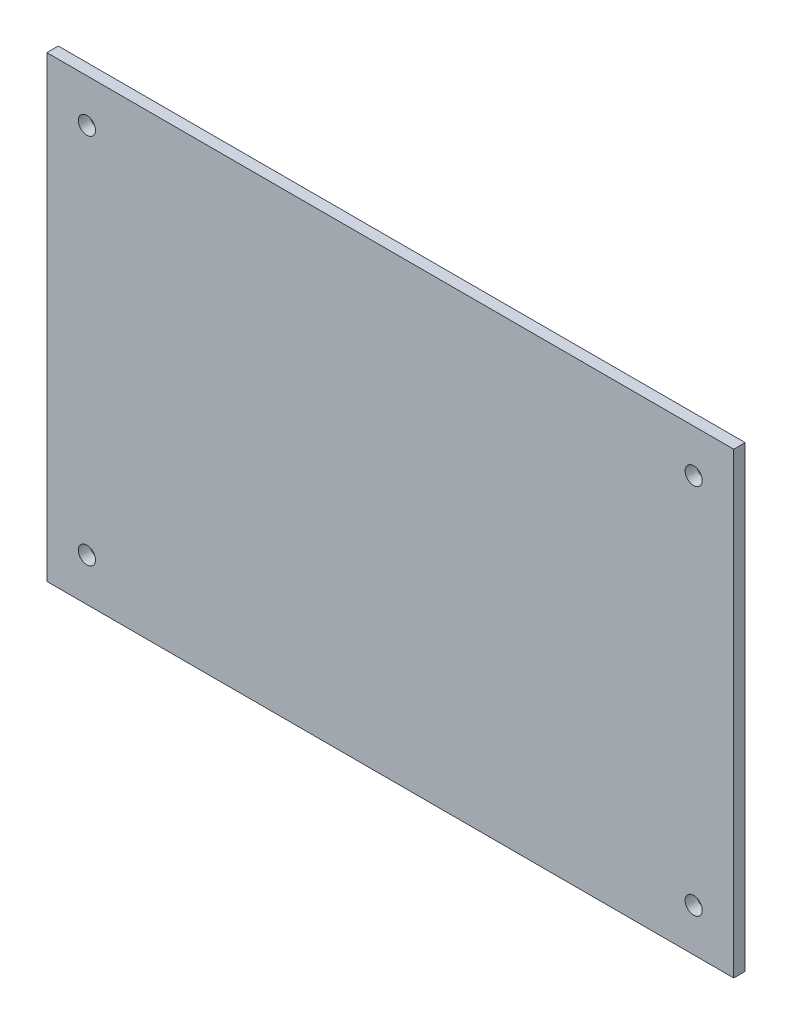
ISO-10303-21;
HEADER;
FILE_DESCRIPTION(('STEP AP214'),'2;1');
FILE_NAME('part.step','',(''),(''),'','','');
FILE_SCHEMA(('AUTOMOTIVE_DESIGN { 1 0 10303 214 1 1 1 1 }'));
ENDSEC;
DATA;
#1=APPLICATION_CONTEXT('core data for automotive mechanical design processes');
#2=APPLICATION_PROTOCOL_DEFINITION('international standard','automotive_design',2000,#1);
#3=PRODUCT_CONTEXT('',#1,'mechanical');
#4=PRODUCT('Part','Part','',(#3));
#5=PRODUCT_RELATED_PRODUCT_CATEGORY('part','',(#4));
#6=PRODUCT_DEFINITION_FORMATION('','',#4);
#7=PRODUCT_DEFINITION_CONTEXT('part definition',#1,'design');
#8=PRODUCT_DEFINITION('design','',#6,#7);
#9=PRODUCT_DEFINITION_SHAPE('','',#8);
#10=(LENGTH_UNIT() NAMED_UNIT(*) SI_UNIT(.MILLI.,.METRE.));
#11=(NAMED_UNIT(*) PLANE_ANGLE_UNIT() SI_UNIT($,.RADIAN.));
#12=(NAMED_UNIT(*) SI_UNIT($,.STERADIAN.) SOLID_ANGLE_UNIT());
#13=UNCERTAINTY_MEASURE_WITH_UNIT(LENGTH_MEASURE(1.E-05),#10,'distance_accuracy_value','');
#14=(GEOMETRIC_REPRESENTATION_CONTEXT(3) GLOBAL_UNCERTAINTY_ASSIGNED_CONTEXT((#13)) GLOBAL_UNIT_ASSIGNED_CONTEXT((#10,
#11,#12)) REPRESENTATION_CONTEXT('',''));
#15=CARTESIAN_POINT('',(0.,0.,0.));
#16=DIRECTION('',(0.,0.,1.));
#17=DIRECTION('',(1.,0.,0.));
#18=AXIS2_PLACEMENT_3D('',#15,#16,#17);
#19=CARTESIAN_POINT('',(0.,0.,2.));
#20=DIRECTION('',(0.,0.,1.));
#21=DIRECTION('',(1.,0.,0.));
#22=AXIS2_PLACEMENT_3D('',#19,#20,#21);
#23=PLANE('',#22);
#24=CARTESIAN_POINT('',(53.,-32.5,2.));
#25=DIRECTION('',(0.,0.,1.));
#26=DIRECTION('',(1.,0.,0.));
#27=AXIS2_PLACEMENT_3D('',#24,#25,#26);
#28=CIRCLE('',#27,1.5);
#29=CARTESIAN_POINT('',(54.5,-32.5,2.));
#30=VERTEX_POINT('',#29);
#31=EDGE_CURVE('E121',#30,#30,#28,.T.);
#32=ORIENTED_EDGE('',*,*,#31,.F.);
#33=EDGE_LOOP('',(#32));
#34=FACE_BOUND('',#33,.T.);
#35=CARTESIAN_POINT('',(-53.,32.5,2.));
#36=DIRECTION('',(0.,0.,1.));
#37=DIRECTION('',(1.,0.,0.));
#38=AXIS2_PLACEMENT_3D('',#35,#36,#37);
#39=CIRCLE('',#38,1.5);
#40=CARTESIAN_POINT('',(-51.5,32.5,2.));
#41=VERTEX_POINT('',#40);
#42=EDGE_CURVE('E100',#41,#41,#39,.T.);
#43=ORIENTED_EDGE('',*,*,#42,.F.);
#44=EDGE_LOOP('',(#43));
#45=FACE_BOUND('',#44,.T.);
#46=DIRECTION('',(0.,-1.,0.));
#47=VECTOR('',#46,1.);
#48=CARTESIAN_POINT('',(-60.,-40.,2.));
#49=LINE('',#48,#47);
#50=CARTESIAN_POINT('',(-60.,40.,2.));
#51=VERTEX_POINT('',#50);
#52=CARTESIAN_POINT('',(-60.,-40.,2.));
#53=VERTEX_POINT('',#52);
#54=EDGE_CURVE('E85',#51,#53,#49,.T.);
#55=ORIENTED_EDGE('',*,*,#54,.T.);
#56=DIRECTION('',(1.,0.,0.));
#57=VECTOR('',#56,1.);
#58=CARTESIAN_POINT('',(60.,-40.,2.));
#59=LINE('',#58,#57);
#60=CARTESIAN_POINT('',(60.,-40.,2.));
#61=VERTEX_POINT('',#60);
#62=EDGE_CURVE('E80',#53,#61,#59,.T.);
#63=ORIENTED_EDGE('',*,*,#62,.T.);
#64=DIRECTION('',(0.,1.,0.));
#65=VECTOR('',#64,1.);
#66=CARTESIAN_POINT('',(60.,-40.,2.));
#67=LINE('',#66,#65);
#68=CARTESIAN_POINT('',(60.,40.,2.));
#69=VERTEX_POINT('',#68);
#70=EDGE_CURVE('E83',#61,#69,#67,.T.);
#71=ORIENTED_EDGE('',*,*,#70,.T.);
#72=DIRECTION('',(-1.,0.,0.));
#73=VECTOR('',#72,1.);
#74=CARTESIAN_POINT('',(60.,40.,2.));
#75=LINE('',#74,#73);
#76=EDGE_CURVE('E50',#69,#51,#75,.T.);
#77=ORIENTED_EDGE('',*,*,#76,.T.);
#78=EDGE_LOOP('',(#55,#63,#71,#77));
#79=FACE_BOUND('',#78,.T.);
#80=CARTESIAN_POINT('',(53.,32.5,2.));
#81=DIRECTION('',(0.,0.,1.));
#82=DIRECTION('',(1.,0.,0.));
#83=AXIS2_PLACEMENT_3D('',#80,#81,#82);
#84=CIRCLE('',#83,1.5);
#85=CARTESIAN_POINT('',(54.5,32.5,2.));
#86=VERTEX_POINT('',#85);
#87=EDGE_CURVE('E115',#86,#86,#84,.T.);
#88=ORIENTED_EDGE('',*,*,#87,.F.);
#89=EDGE_LOOP('',(#88));
#90=FACE_BOUND('',#89,.T.);
#91=CARTESIAN_POINT('',(-53.,-32.5,2.));
#92=DIRECTION('',(0.,0.,1.));
#93=DIRECTION('',(1.,0.,0.));
#94=AXIS2_PLACEMENT_3D('',#91,#92,#93);
#95=CIRCLE('',#94,1.5);
#96=CARTESIAN_POINT('',(-51.5,-32.5,2.));
#97=VERTEX_POINT('',#96);
#98=EDGE_CURVE('E127',#97,#97,#95,.T.);
#99=ORIENTED_EDGE('',*,*,#98,.F.);
#100=EDGE_LOOP('',(#99));
#101=FACE_BOUND('',#100,.T.);
#102=ADVANCED_FACE('F33',(#34,#45,#79,#90,#101),#23,.T.);
#103=CARTESIAN_POINT('',(0.,0.,0.));
#104=DIRECTION('',(0.,0.,1.));
#105=DIRECTION('',(1.,0.,0.));
#106=AXIS2_PLACEMENT_3D('',#103,#104,#105);
#107=PLANE('',#106);
#108=DIRECTION('',(0.,-1.,0.));
#109=VECTOR('',#108,1.);
#110=CARTESIAN_POINT('',(-60.,-40.,0.));
#111=LINE('',#110,#109);
#112=CARTESIAN_POINT('',(-60.,40.,0.));
#113=VERTEX_POINT('',#112);
#114=CARTESIAN_POINT('',(-60.,-40.,0.));
#115=VERTEX_POINT('',#114);
#116=EDGE_CURVE('E97',#113,#115,#111,.T.);
#117=ORIENTED_EDGE('',*,*,#116,.F.);
#118=DIRECTION('',(-1.,0.,0.));
#119=VECTOR('',#118,1.);
#120=CARTESIAN_POINT('',(60.,40.,0.));
#121=LINE('',#120,#119);
#122=CARTESIAN_POINT('',(60.,40.,0.));
#123=VERTEX_POINT('',#122);
#124=EDGE_CURVE('E73',#123,#113,#121,.T.);
#125=ORIENTED_EDGE('',*,*,#124,.F.);
#126=DIRECTION('',(0.,1.,0.));
#127=VECTOR('',#126,1.);
#128=CARTESIAN_POINT('',(60.,-40.,0.));
#129=LINE('',#128,#127);
#130=CARTESIAN_POINT('',(60.,-40.,0.));
#131=VERTEX_POINT('',#130);
#132=EDGE_CURVE('E67',#131,#123,#129,.T.);
#133=ORIENTED_EDGE('',*,*,#132,.F.);
#134=DIRECTION('',(1.,0.,0.));
#135=VECTOR('',#134,1.);
#136=CARTESIAN_POINT('',(60.,-40.,0.));
#137=LINE('',#136,#135);
#138=EDGE_CURVE('E89',#115,#131,#137,.T.);
#139=ORIENTED_EDGE('',*,*,#138,.F.);
#140=EDGE_LOOP('',(#117,#125,#133,#139));
#141=FACE_BOUND('',#140,.T.);
#142=CARTESIAN_POINT('',(-53.,32.5,0.));
#143=DIRECTION('',(0.,0.,1.));
#144=DIRECTION('',(1.,0.,0.));
#145=AXIS2_PLACEMENT_3D('',#142,#143,#144);
#146=CIRCLE('',#145,1.5);
#147=CARTESIAN_POINT('',(-51.5,32.5,0.));
#148=VERTEX_POINT('',#147);
#149=EDGE_CURVE('E112',#148,#148,#146,.T.);
#150=ORIENTED_EDGE('',*,*,#149,.T.);
#151=EDGE_LOOP('',(#150));
#152=FACE_BOUND('',#151,.T.);
#153=CARTESIAN_POINT('',(53.,32.5,0.));
#154=DIRECTION('',(0.,0.,1.));
#155=DIRECTION('',(1.,0.,0.));
#156=AXIS2_PLACEMENT_3D('',#153,#154,#155);
#157=CIRCLE('',#156,1.5);
#158=CARTESIAN_POINT('',(54.5,32.5,0.));
#159=VERTEX_POINT('',#158);
#160=EDGE_CURVE('E118',#159,#159,#157,.T.);
#161=ORIENTED_EDGE('',*,*,#160,.T.);
#162=EDGE_LOOP('',(#161));
#163=FACE_BOUND('',#162,.T.);
#164=CARTESIAN_POINT('',(53.,-32.5,0.));
#165=DIRECTION('',(0.,0.,1.));
#166=DIRECTION('',(1.,0.,0.));
#167=AXIS2_PLACEMENT_3D('',#164,#165,#166);
#168=CIRCLE('',#167,1.5);
#169=CARTESIAN_POINT('',(54.5,-32.5,0.));
#170=VERTEX_POINT('',#169);
#171=EDGE_CURVE('E124',#170,#170,#168,.T.);
#172=ORIENTED_EDGE('',*,*,#171,.T.);
#173=EDGE_LOOP('',(#172));
#174=FACE_BOUND('',#173,.T.);
#175=CARTESIAN_POINT('',(-53.,-32.5,0.));
#176=DIRECTION('',(0.,0.,1.));
#177=DIRECTION('',(1.,0.,0.));
#178=AXIS2_PLACEMENT_3D('',#175,#176,#177);
#179=CIRCLE('',#178,1.5);
#180=CARTESIAN_POINT('',(-51.5,-32.5,0.));
#181=VERTEX_POINT('',#180);
#182=EDGE_CURVE('E130',#181,#181,#179,.T.);
#183=ORIENTED_EDGE('',*,*,#182,.T.);
#184=EDGE_LOOP('',(#183));
#185=FACE_BOUND('',#184,.T.);
#186=ADVANCED_FACE('F108',(#141,#152,#163,#174,#185),#107,.F.);
#187=CARTESIAN_POINT('',(-60.,-40.,2.));
#188=DIRECTION('',(1.,0.,0.));
#189=DIRECTION('',(0.,0.,-1.));
#190=AXIS2_PLACEMENT_3D('',#187,#188,#189);
#191=PLANE('',#190);
#192=ORIENTED_EDGE('',*,*,#116,.T.);
#193=DIRECTION('',(0.,0.,-1.));
#194=VECTOR('',#193,1.);
#195=CARTESIAN_POINT('',(-60.,-40.,2.));
#196=LINE('',#195,#194);
#197=EDGE_CURVE('E11',#53,#115,#196,.T.);
#198=ORIENTED_EDGE('',*,*,#197,.F.);
#199=ORIENTED_EDGE('',*,*,#54,.F.);
#200=DIRECTION('',(0.,0.,-1.));
#201=VECTOR('',#200,1.);
#202=CARTESIAN_POINT('',(-60.,40.,2.));
#203=LINE('',#202,#201);
#204=EDGE_CURVE('E93',#51,#113,#203,.T.);
#205=ORIENTED_EDGE('',*,*,#204,.T.);
#206=EDGE_LOOP('',(#192,#198,#199,#205));
#207=FACE_BOUND('',#206,.T.);
#208=ADVANCED_FACE('F35',(#207),#191,.F.);
#209=CARTESIAN_POINT('',(60.,-40.,2.));
#210=DIRECTION('',(0.,1.,0.));
#211=DIRECTION('',(-1.,0.,0.));
#212=AXIS2_PLACEMENT_3D('',#209,#210,#211);
#213=PLANE('',#212);
#214=ORIENTED_EDGE('',*,*,#138,.T.);
#215=DIRECTION('',(0.,0.,-1.));
#216=VECTOR('',#215,1.);
#217=CARTESIAN_POINT('',(60.,-40.,2.));
#218=LINE('',#217,#216);
#219=EDGE_CURVE('E42',#61,#131,#218,.T.);
#220=ORIENTED_EDGE('',*,*,#219,.F.);
#221=ORIENTED_EDGE('',*,*,#62,.F.);
#222=ORIENTED_EDGE('',*,*,#197,.T.);
#223=EDGE_LOOP('',(#214,#220,#221,#222));
#224=FACE_BOUND('',#223,.T.);
#225=ADVANCED_FACE('F88',(#224),#213,.F.);
#226=CARTESIAN_POINT('',(60.,-40.,2.));
#227=DIRECTION('',(-1.,0.,0.));
#228=DIRECTION('',(0.,0.,1.));
#229=AXIS2_PLACEMENT_3D('',#226,#227,#228);
#230=PLANE('',#229);
#231=ORIENTED_EDGE('',*,*,#132,.T.);
#232=DIRECTION('',(0.,0.,-1.));
#233=VECTOR('',#232,1.);
#234=CARTESIAN_POINT('',(60.,40.,2.));
#235=LINE('',#234,#233);
#236=EDGE_CURVE('E90',#69,#123,#235,.T.);
#237=ORIENTED_EDGE('',*,*,#236,.F.);
#238=ORIENTED_EDGE('',*,*,#70,.F.);
#239=ORIENTED_EDGE('',*,*,#219,.T.);
#240=EDGE_LOOP('',(#231,#237,#238,#239));
#241=FACE_BOUND('',#240,.T.);
#242=ADVANCED_FACE('F91',(#241),#230,.F.);
#243=CARTESIAN_POINT('',(60.,40.,2.));
#244=DIRECTION('',(0.,-1.,0.));
#245=DIRECTION('',(1.,0.,0.));
#246=AXIS2_PLACEMENT_3D('',#243,#244,#245);
#247=PLANE('',#246);
#248=ORIENTED_EDGE('',*,*,#124,.T.);
#249=ORIENTED_EDGE('',*,*,#204,.F.);
#250=ORIENTED_EDGE('',*,*,#76,.F.);
#251=ORIENTED_EDGE('',*,*,#236,.T.);
#252=EDGE_LOOP('',(#248,#249,#250,#251));
#253=FACE_BOUND('',#252,.T.);
#254=ADVANCED_FACE('F105',(#253),#247,.F.);
#255=CARTESIAN_POINT('',(-53.,32.5,2.));
#256=DIRECTION('',(0.,0.,-1.));
#257=DIRECTION('',(-1.,0.,0.));
#258=AXIS2_PLACEMENT_3D('',#255,#256,#257);
#259=CYLINDRICAL_SURFACE('',#258,1.5);
#260=ORIENTED_EDGE('',*,*,#42,.T.);
#261=EDGE_LOOP('',(#260));
#262=FACE_BOUND('',#261,.T.);
#263=ORIENTED_EDGE('',*,*,#149,.F.);
#264=EDGE_LOOP('',(#263));
#265=FACE_BOUND('',#264,.T.);
#266=ADVANCED_FACE('F149',(#262,#265),#259,.F.);
#267=CARTESIAN_POINT('',(53.,32.5,2.));
#268=DIRECTION('',(0.,0.,-1.));
#269=DIRECTION('',(-1.,0.,0.));
#270=AXIS2_PLACEMENT_3D('',#267,#268,#269);
#271=CYLINDRICAL_SURFACE('',#270,1.5);
#272=ORIENTED_EDGE('',*,*,#87,.T.);
#273=EDGE_LOOP('',(#272));
#274=FACE_BOUND('',#273,.T.);
#275=ORIENTED_EDGE('',*,*,#160,.F.);
#276=EDGE_LOOP('',(#275));
#277=FACE_BOUND('',#276,.T.);
#278=ADVANCED_FACE('F195',(#274,#277),#271,.F.);
#279=CARTESIAN_POINT('',(53.,-32.5,2.));
#280=DIRECTION('',(0.,0.,-1.));
#281=DIRECTION('',(-1.,0.,0.));
#282=AXIS2_PLACEMENT_3D('',#279,#280,#281);
#283=CYLINDRICAL_SURFACE('',#282,1.5);
#284=ORIENTED_EDGE('',*,*,#31,.T.);
#285=EDGE_LOOP('',(#284));
#286=FACE_BOUND('',#285,.T.);
#287=ORIENTED_EDGE('',*,*,#171,.F.);
#288=EDGE_LOOP('',(#287));
#289=FACE_BOUND('',#288,.T.);
#290=ADVANCED_FACE('F203',(#286,#289),#283,.F.);
#291=CARTESIAN_POINT('',(-53.,-32.5,2.));
#292=DIRECTION('',(0.,0.,-1.));
#293=DIRECTION('',(-1.,0.,0.));
#294=AXIS2_PLACEMENT_3D('',#291,#292,#293);
#295=CYLINDRICAL_SURFACE('',#294,1.5);
#296=ORIENTED_EDGE('',*,*,#98,.T.);
#297=EDGE_LOOP('',(#296));
#298=FACE_BOUND('',#297,.T.);
#299=ORIENTED_EDGE('',*,*,#182,.F.);
#300=EDGE_LOOP('',(#299));
#301=FACE_BOUND('',#300,.T.);
#302=ADVANCED_FACE('F136',(#298,#301),#295,.F.);
#303=CLOSED_SHELL('',(#102,#186,#208,#225,#242,#254,#266,#278,#290,#302));
#304=MANIFOLD_SOLID_BREP('B2',#303);
#305=ADVANCED_BREP_SHAPE_REPRESENTATION('',(#18,#304),#14);
#306=SHAPE_DEFINITION_REPRESENTATION(#9,#305);
ENDSEC;
END-ISO-10303-21;
